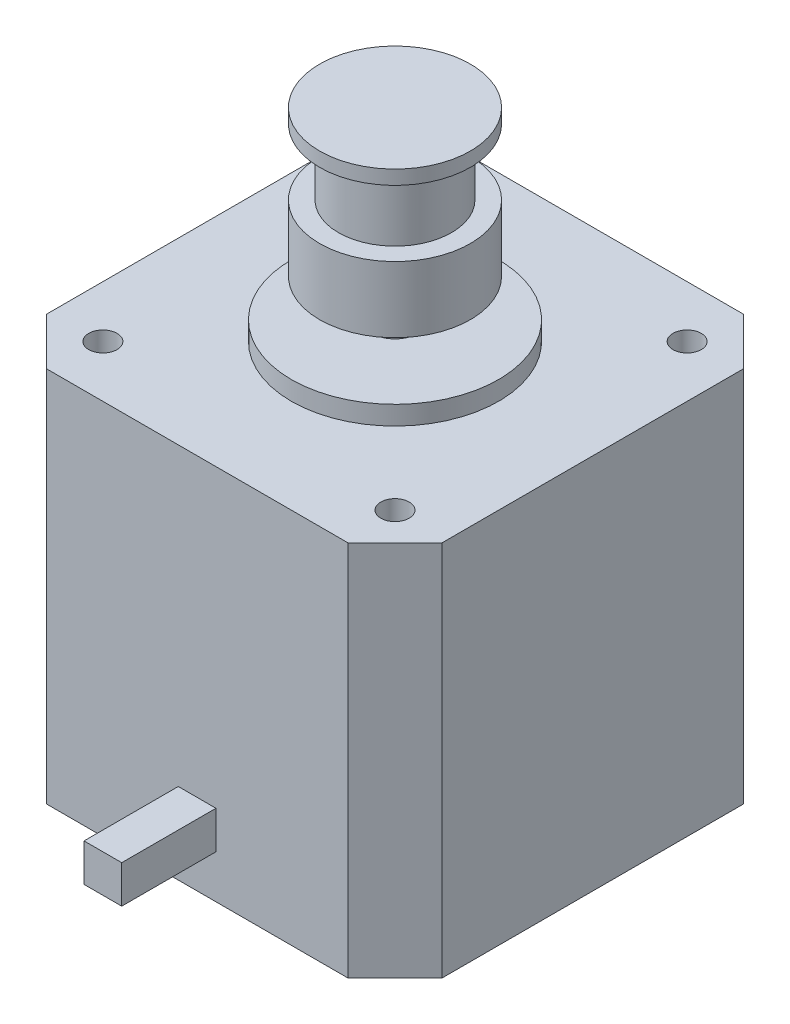
ISO-10303-21;
HEADER;
FILE_DESCRIPTION(('STEP AP214'),'2;1');
FILE_NAME('part.step','',(''),(''),'','','');
FILE_SCHEMA(('AUTOMOTIVE_DESIGN { 1 0 10303 214 1 1 1 1 }'));
ENDSEC;
DATA;
#1=APPLICATION_CONTEXT('core data for automotive mechanical design processes');
#2=APPLICATION_PROTOCOL_DEFINITION('international standard','automotive_design',2000,#1);
#3=PRODUCT_CONTEXT('',#1,'mechanical');
#4=PRODUCT('Part','Part','',(#3));
#5=PRODUCT_RELATED_PRODUCT_CATEGORY('part','',(#4));
#6=PRODUCT_DEFINITION_FORMATION('','',#4);
#7=PRODUCT_DEFINITION_CONTEXT('part definition',#1,'design');
#8=PRODUCT_DEFINITION('design','',#6,#7);
#9=PRODUCT_DEFINITION_SHAPE('','',#8);
#10=(LENGTH_UNIT() NAMED_UNIT(*) SI_UNIT(.MILLI.,.METRE.));
#11=(NAMED_UNIT(*) PLANE_ANGLE_UNIT() SI_UNIT($,.RADIAN.));
#12=(NAMED_UNIT(*) SI_UNIT($,.STERADIAN.) SOLID_ANGLE_UNIT());
#13=UNCERTAINTY_MEASURE_WITH_UNIT(LENGTH_MEASURE(1.E-05),#10,'distance_accuracy_value','');
#14=(GEOMETRIC_REPRESENTATION_CONTEXT(3) GLOBAL_UNCERTAINTY_ASSIGNED_CONTEXT((#13)) GLOBAL_UNIT_ASSIGNED_CONTEXT((#10,
#11,#12)) REPRESENTATION_CONTEXT('',''));
#15=CARTESIAN_POINT('',(0.,0.,0.));
#16=DIRECTION('',(0.,0.,1.));
#17=DIRECTION('',(1.,0.,0.));
#18=AXIS2_PLACEMENT_3D('',#15,#16,#17);
#19=CARTESIAN_POINT('',(-21.,40.,21.));
#20=DIRECTION('',(0.,0.,-1.));
#21=DIRECTION('',(-1.,0.,0.));
#22=AXIS2_PLACEMENT_3D('',#19,#20,#21);
#23=PLANE('',#22);
#24=DIRECTION('',(1.,0.,0.));
#25=VECTOR('',#24,1.);
#26=CARTESIAN_POINT('',(-21.,40.,21.));
#27=LINE('',#26,#25);
#28=CARTESIAN_POINT('',(-16.,40.,21.));
#29=VERTEX_POINT('',#28);
#30=CARTESIAN_POINT('',(16.,40.,21.));
#31=VERTEX_POINT('',#30);
#32=EDGE_CURVE('E245',#29,#31,#27,.T.);
#33=ORIENTED_EDGE('',*,*,#32,.F.);
#34=DIRECTION('',(0.,-1.,0.));
#35=VECTOR('',#34,1.);
#36=CARTESIAN_POINT('',(-16.,40.,21.));
#37=LINE('',#36,#35);
#38=CARTESIAN_POINT('',(-16.,0.,21.));
#39=VERTEX_POINT('',#38);
#40=EDGE_CURVE('E46',#29,#39,#37,.T.);
#41=ORIENTED_EDGE('',*,*,#40,.T.);
#42=DIRECTION('',(1.,0.,0.));
#43=VECTOR('',#42,1.);
#44=CARTESIAN_POINT('',(-21.,0.,21.));
#45=LINE('',#44,#43);
#46=CARTESIAN_POINT('',(16.,0.,21.));
#47=VERTEX_POINT('',#46);
#48=EDGE_CURVE('E237',#39,#47,#45,.T.);
#49=ORIENTED_EDGE('',*,*,#48,.T.);
#50=DIRECTION('',(0.,1.,0.));
#51=VECTOR('',#50,1.);
#52=CARTESIAN_POINT('',(16.,40.,21.));
#53=LINE('',#52,#51);
#54=EDGE_CURVE('E307',#47,#31,#53,.T.);
#55=ORIENTED_EDGE('',*,*,#54,.T.);
#56=EDGE_LOOP('',(#33,#41,#49,#55));
#57=FACE_BOUND('',#56,.T.);
#58=DIRECTION('',(0.,1.,0.));
#59=VECTOR('',#58,1.);
#60=CARTESIAN_POINT('',(2.,4.6,21.));
#61=LINE('',#60,#59);
#62=CARTESIAN_POINT('',(2.,4.6,21.));
#63=VERTEX_POINT('',#62);
#64=CARTESIAN_POINT('',(2.,8.6,21.));
#65=VERTEX_POINT('',#64);
#66=EDGE_CURVE('E156',#63,#65,#61,.T.);
#67=ORIENTED_EDGE('',*,*,#66,.F.);
#68=DIRECTION('',(1.,0.,0.));
#69=VECTOR('',#68,1.);
#70=CARTESIAN_POINT('',(-2.,4.6,21.));
#71=LINE('',#70,#69);
#72=CARTESIAN_POINT('',(-2.,4.6,21.));
#73=VERTEX_POINT('',#72);
#74=EDGE_CURVE('E153',#73,#63,#71,.T.);
#75=ORIENTED_EDGE('',*,*,#74,.F.);
#76=DIRECTION('',(0.,-1.,0.));
#77=VECTOR('',#76,1.);
#78=CARTESIAN_POINT('',(-2.,4.6,21.));
#79=LINE('',#78,#77);
#80=CARTESIAN_POINT('',(-2.,8.6,21.));
#81=VERTEX_POINT('',#80);
#82=EDGE_CURVE('E65',#81,#73,#79,.T.);
#83=ORIENTED_EDGE('',*,*,#82,.F.);
#84=DIRECTION('',(-1.,0.,0.));
#85=VECTOR('',#84,1.);
#86=CARTESIAN_POINT('',(-2.,8.6,21.));
#87=LINE('',#86,#85);
#88=EDGE_CURVE('E60',#65,#81,#87,.T.);
#89=ORIENTED_EDGE('',*,*,#88,.F.);
#90=EDGE_LOOP('',(#67,#75,#83,#89));
#91=FACE_BOUND('',#90,.T.);
#92=ADVANCED_FACE('F41',(#57,#91),#23,.F.);
#93=CARTESIAN_POINT('',(21.,40.,21.));
#94=DIRECTION('',(-1.,0.,0.));
#95=DIRECTION('',(0.,0.,1.));
#96=AXIS2_PLACEMENT_3D('',#93,#94,#95);
#97=PLANE('',#96);
#98=DIRECTION('',(0.,0.,-1.));
#99=VECTOR('',#98,1.);
#100=CARTESIAN_POINT('',(21.,0.,21.));
#101=LINE('',#100,#99);
#102=CARTESIAN_POINT('',(21.,0.,16.));
#103=VERTEX_POINT('',#102);
#104=CARTESIAN_POINT('',(21.,0.,-16.));
#105=VERTEX_POINT('',#104);
#106=EDGE_CURVE('E228',#103,#105,#101,.T.);
#107=ORIENTED_EDGE('',*,*,#106,.T.);
#108=DIRECTION('',(0.,1.,0.));
#109=VECTOR('',#108,1.);
#110=CARTESIAN_POINT('',(21.,40.,-16.));
#111=LINE('',#110,#109);
#112=CARTESIAN_POINT('',(21.,40.,-16.));
#113=VERTEX_POINT('',#112);
#114=EDGE_CURVE('E305',#105,#113,#111,.T.);
#115=ORIENTED_EDGE('',*,*,#114,.T.);
#116=DIRECTION('',(0.,0.,-1.));
#117=VECTOR('',#116,1.);
#118=CARTESIAN_POINT('',(21.,40.,21.));
#119=LINE('',#118,#117);
#120=CARTESIAN_POINT('',(21.,40.,16.));
#121=VERTEX_POINT('',#120);
#122=EDGE_CURVE('E232',#121,#113,#119,.T.);
#123=ORIENTED_EDGE('',*,*,#122,.F.);
#124=DIRECTION('',(0.,-1.,0.));
#125=VECTOR('',#124,1.);
#126=CARTESIAN_POINT('',(21.,40.,16.));
#127=LINE('',#126,#125);
#128=EDGE_CURVE('E301',#121,#103,#127,.T.);
#129=ORIENTED_EDGE('',*,*,#128,.T.);
#130=EDGE_LOOP('',(#107,#115,#123,#129));
#131=FACE_BOUND('',#130,.T.);
#132=ADVANCED_FACE('F327',(#131),#97,.F.);
#133=CARTESIAN_POINT('',(-21.,40.,-21.));
#134=DIRECTION('',(0.,0.,1.));
#135=DIRECTION('',(1.,0.,0.));
#136=AXIS2_PLACEMENT_3D('',#133,#134,#135);
#137=PLANE('',#136);
#138=DIRECTION('',(-1.,0.,0.));
#139=VECTOR('',#138,1.);
#140=CARTESIAN_POINT('',(-21.,0.,-21.));
#141=LINE('',#140,#139);
#142=CARTESIAN_POINT('',(16.,0.,-21.));
#143=VERTEX_POINT('',#142);
#144=CARTESIAN_POINT('',(-16.,0.,-21.));
#145=VERTEX_POINT('',#144);
#146=EDGE_CURVE('E253',#143,#145,#141,.T.);
#147=ORIENTED_EDGE('',*,*,#146,.T.);
#148=DIRECTION('',(0.,1.,0.));
#149=VECTOR('',#148,1.);
#150=CARTESIAN_POINT('',(-16.,40.,-21.));
#151=LINE('',#150,#149);
#152=CARTESIAN_POINT('',(-16.,40.,-21.));
#153=VERTEX_POINT('',#152);
#154=EDGE_CURVE('E286',#145,#153,#151,.T.);
#155=ORIENTED_EDGE('',*,*,#154,.T.);
#156=DIRECTION('',(-1.,0.,0.));
#157=VECTOR('',#156,1.);
#158=CARTESIAN_POINT('',(-21.,40.,-21.));
#159=LINE('',#158,#157);
#160=CARTESIAN_POINT('',(16.,40.,-21.));
#161=VERTEX_POINT('',#160);
#162=EDGE_CURVE('E236',#161,#153,#159,.T.);
#163=ORIENTED_EDGE('',*,*,#162,.F.);
#164=DIRECTION('',(0.,-1.,0.));
#165=VECTOR('',#164,1.);
#166=CARTESIAN_POINT('',(16.,40.,-21.));
#167=LINE('',#166,#165);
#168=EDGE_CURVE('E282',#161,#143,#167,.T.);
#169=ORIENTED_EDGE('',*,*,#168,.T.);
#170=EDGE_LOOP('',(#147,#155,#163,#169));
#171=FACE_BOUND('',#170,.T.);
#172=ADVANCED_FACE('F338',(#171),#137,.F.);
#173=CARTESIAN_POINT('',(-21.,40.,21.));
#174=DIRECTION('',(1.,0.,0.));
#175=DIRECTION('',(0.,0.,-1.));
#176=AXIS2_PLACEMENT_3D('',#173,#174,#175);
#177=PLANE('',#176);
#178=DIRECTION('',(0.,0.,1.));
#179=VECTOR('',#178,1.);
#180=CARTESIAN_POINT('',(-21.,40.,21.));
#181=LINE('',#180,#179);
#182=CARTESIAN_POINT('',(-21.,40.,-16.));
#183=VERTEX_POINT('',#182);
#184=CARTESIAN_POINT('',(-21.,40.,16.));
#185=VERTEX_POINT('',#184);
#186=EDGE_CURVE('E241',#183,#185,#181,.T.);
#187=ORIENTED_EDGE('',*,*,#186,.F.);
#188=DIRECTION('',(0.,-1.,0.));
#189=VECTOR('',#188,1.);
#190=CARTESIAN_POINT('',(-21.,40.,-16.));
#191=LINE('',#190,#189);
#192=CARTESIAN_POINT('',(-21.,0.,-16.));
#193=VERTEX_POINT('',#192);
#194=EDGE_CURVE('E266',#183,#193,#191,.T.);
#195=ORIENTED_EDGE('',*,*,#194,.T.);
#196=DIRECTION('',(0.,0.,1.));
#197=VECTOR('',#196,1.);
#198=CARTESIAN_POINT('',(-21.,0.,21.));
#199=LINE('',#198,#197);
#200=CARTESIAN_POINT('',(-21.,0.,16.));
#201=VERTEX_POINT('',#200);
#202=EDGE_CURVE('E257',#193,#201,#199,.T.);
#203=ORIENTED_EDGE('',*,*,#202,.T.);
#204=DIRECTION('',(0.,1.,0.));
#205=VECTOR('',#204,1.);
#206=CARTESIAN_POINT('',(-21.,40.,16.));
#207=LINE('',#206,#205);
#208=EDGE_CURVE('E249',#201,#185,#207,.T.);
#209=ORIENTED_EDGE('',*,*,#208,.T.);
#210=EDGE_LOOP('',(#187,#195,#203,#209));
#211=FACE_BOUND('',#210,.T.);
#212=ADVANCED_FACE('F346',(#211),#177,.F.);
#213=CARTESIAN_POINT('',(0.,40.,0.));
#214=DIRECTION('',(0.,-1.,0.));
#215=DIRECTION('',(0.,0.,-1.));
#216=AXIS2_PLACEMENT_3D('',#213,#214,#215);
#217=PLANE('',#216);
#218=CARTESIAN_POINT('',(-15.5,40.,15.5));
#219=DIRECTION('',(0.,1.,0.));
#220=DIRECTION('',(0.,0.,1.));
#221=AXIS2_PLACEMENT_3D('',#218,#219,#220);
#222=CIRCLE('',#221,1.5);
#223=CARTESIAN_POINT('',(-15.5,40.,17.));
#224=VERTEX_POINT('',#223);
#225=EDGE_CURVE('E158',#224,#224,#222,.T.);
#226=ORIENTED_EDGE('',*,*,#225,.F.);
#227=EDGE_LOOP('',(#226));
#228=FACE_BOUND('',#227,.T.);
#229=CARTESIAN_POINT('',(15.5,40.,15.5));
#230=DIRECTION('',(0.,1.,0.));
#231=DIRECTION('',(0.,0.,1.));
#232=AXIS2_PLACEMENT_3D('',#229,#230,#231);
#233=CIRCLE('',#232,1.5);
#234=CARTESIAN_POINT('',(15.5,40.,17.));
#235=VERTEX_POINT('',#234);
#236=EDGE_CURVE('E182',#235,#235,#233,.T.);
#237=ORIENTED_EDGE('',*,*,#236,.F.);
#238=EDGE_LOOP('',(#237));
#239=FACE_BOUND('',#238,.T.);
#240=CARTESIAN_POINT('',(15.5,40.,-15.5));
#241=DIRECTION('',(0.,1.,0.));
#242=DIRECTION('',(0.,0.,1.));
#243=AXIS2_PLACEMENT_3D('',#240,#241,#242);
#244=CIRCLE('',#243,1.5);
#245=CARTESIAN_POINT('',(15.5,40.,-14.));
#246=VERTEX_POINT('',#245);
#247=EDGE_CURVE('E174',#246,#246,#244,.T.);
#248=ORIENTED_EDGE('',*,*,#247,.F.);
#249=EDGE_LOOP('',(#248));
#250=FACE_BOUND('',#249,.T.);
#251=CARTESIAN_POINT('',(-15.5,40.,-15.5));
#252=DIRECTION('',(0.,1.,0.));
#253=DIRECTION('',(0.,0.,1.));
#254=AXIS2_PLACEMENT_3D('',#251,#252,#253);
#255=CIRCLE('',#254,1.5);
#256=CARTESIAN_POINT('',(-15.5,40.,-14.));
#257=VERTEX_POINT('',#256);
#258=EDGE_CURVE('E173',#257,#257,#255,.T.);
#259=ORIENTED_EDGE('',*,*,#258,.F.);
#260=EDGE_LOOP('',(#259));
#261=FACE_BOUND('',#260,.T.);
#262=CARTESIAN_POINT('',(0.,40.,0.));
#263=DIRECTION('',(0.,1.,0.));
#264=DIRECTION('',(0.,0.,1.));
#265=AXIS2_PLACEMENT_3D('',#262,#263,#264);
#266=CIRCLE('',#265,11.);
#267=CARTESIAN_POINT('',(0.,40.,11.));
#268=VERTEX_POINT('',#267);
#269=EDGE_CURVE('E224',#268,#268,#266,.T.);
#270=ORIENTED_EDGE('',*,*,#269,.F.);
#271=EDGE_LOOP('',(#270));
#272=FACE_BOUND('',#271,.T.);
#273=ORIENTED_EDGE('',*,*,#162,.T.);
#274=DIRECTION('',(0.707106781186549,0.,-0.707106781186546));
#275=VECTOR('',#274,1.);
#276=CARTESIAN_POINT('',(-21.,40.,-16.));
#277=LINE('',#276,#275);
#278=EDGE_CURVE('E298',#153,#183,#277,.F.);
#279=ORIENTED_EDGE('',*,*,#278,.T.);
#280=ORIENTED_EDGE('',*,*,#186,.T.);
#281=DIRECTION('',(-0.707106781186547,0.,-0.707106781186549));
#282=VECTOR('',#281,1.);
#283=CARTESIAN_POINT('',(-16.,40.,21.));
#284=LINE('',#283,#282);
#285=EDGE_CURVE('E292',#185,#29,#284,.F.);
#286=ORIENTED_EDGE('',*,*,#285,.T.);
#287=ORIENTED_EDGE('',*,*,#32,.T.);
#288=DIRECTION('',(-0.707106781186549,0.,0.707106781186547));
#289=VECTOR('',#288,1.);
#290=CARTESIAN_POINT('',(21.,40.,16.));
#291=LINE('',#290,#289);
#292=EDGE_CURVE('E289',#31,#121,#291,.F.);
#293=ORIENTED_EDGE('',*,*,#292,.T.);
#294=ORIENTED_EDGE('',*,*,#122,.T.);
#295=DIRECTION('',(0.707106781186547,0.,0.707106781186549));
#296=VECTOR('',#295,1.);
#297=CARTESIAN_POINT('',(16.,40.,-21.));
#298=LINE('',#297,#296);
#299=EDGE_CURVE('E295',#113,#161,#298,.F.);
#300=ORIENTED_EDGE('',*,*,#299,.T.);
#301=EDGE_LOOP('',(#273,#279,#280,#286,#287,#293,#294,#300));
#302=FACE_BOUND('',#301,.T.);
#303=ADVANCED_FACE('F331',(#228,#239,#250,#261,#272,#302),#217,.F.);
#304=CARTESIAN_POINT('',(0.,0.,0.));
#305=DIRECTION('',(0.,-1.,0.));
#306=DIRECTION('',(0.,0.,-1.));
#307=AXIS2_PLACEMENT_3D('',#304,#305,#306);
#308=PLANE('',#307);
#309=ORIENTED_EDGE('',*,*,#202,.F.);
#310=DIRECTION('',(-0.707106781186549,0.,0.707106781186546));
#311=VECTOR('',#310,1.);
#312=CARTESIAN_POINT('',(-18.5,0.,-18.5));
#313=LINE('',#312,#311);
#314=EDGE_CURVE('E279',#193,#145,#313,.F.);
#315=ORIENTED_EDGE('',*,*,#314,.T.);
#316=ORIENTED_EDGE('',*,*,#146,.F.);
#317=DIRECTION('',(-0.707106781186547,0.,-0.707106781186549));
#318=VECTOR('',#317,1.);
#319=CARTESIAN_POINT('',(18.5,0.,-18.5));
#320=LINE('',#319,#318);
#321=EDGE_CURVE('E276',#143,#105,#320,.F.);
#322=ORIENTED_EDGE('',*,*,#321,.T.);
#323=ORIENTED_EDGE('',*,*,#106,.F.);
#324=DIRECTION('',(0.707106781186549,0.,-0.707106781186547));
#325=VECTOR('',#324,1.);
#326=CARTESIAN_POINT('',(18.5,0.,18.5));
#327=LINE('',#326,#325);
#328=EDGE_CURVE('E270',#103,#47,#327,.F.);
#329=ORIENTED_EDGE('',*,*,#328,.T.);
#330=ORIENTED_EDGE('',*,*,#48,.F.);
#331=DIRECTION('',(0.707106781186547,0.,0.707106781186549));
#332=VECTOR('',#331,1.);
#333=CARTESIAN_POINT('',(-18.5,0.,18.5));
#334=LINE('',#333,#332);
#335=EDGE_CURVE('E273',#39,#201,#334,.F.);
#336=ORIENTED_EDGE('',*,*,#335,.T.);
#337=EDGE_LOOP('',(#309,#315,#316,#322,#323,#329,#330,#336));
#338=FACE_BOUND('',#337,.T.);
#339=ADVANCED_FACE('F320',(#338),#308,.T.);
#340=CARTESIAN_POINT('',(-21.,40.,-16.));
#341=DIRECTION('',(0.707106781186546,0.,0.707106781186549));
#342=DIRECTION('',(0.,-1.,0.));
#343=AXIS2_PLACEMENT_3D('',#340,#341,#342);
#344=PLANE('',#343);
#345=ORIENTED_EDGE('',*,*,#278,.F.);
#346=ORIENTED_EDGE('',*,*,#154,.F.);
#347=ORIENTED_EDGE('',*,*,#314,.F.);
#348=ORIENTED_EDGE('',*,*,#194,.F.);
#349=EDGE_LOOP('',(#345,#346,#347,#348));
#350=FACE_BOUND('',#349,.T.);
#351=ADVANCED_FACE('F343',(#350),#344,.F.);
#352=CARTESIAN_POINT('',(16.,40.,-21.));
#353=DIRECTION('',(-0.707106781186549,0.,0.707106781186547));
#354=DIRECTION('',(0.,-1.,0.));
#355=AXIS2_PLACEMENT_3D('',#352,#353,#354);
#356=PLANE('',#355);
#357=ORIENTED_EDGE('',*,*,#299,.F.);
#358=ORIENTED_EDGE('',*,*,#114,.F.);
#359=ORIENTED_EDGE('',*,*,#321,.F.);
#360=ORIENTED_EDGE('',*,*,#168,.F.);
#361=EDGE_LOOP('',(#357,#358,#359,#360));
#362=FACE_BOUND('',#361,.T.);
#363=ADVANCED_FACE('F335',(#362),#356,.F.);
#364=CARTESIAN_POINT('',(-16.,40.,21.));
#365=DIRECTION('',(0.707106781186548,0.,-0.707106781186546));
#366=DIRECTION('',(0.,-1.,0.));
#367=AXIS2_PLACEMENT_3D('',#364,#365,#366);
#368=PLANE('',#367);
#369=ORIENTED_EDGE('',*,*,#285,.F.);
#370=ORIENTED_EDGE('',*,*,#208,.F.);
#371=ORIENTED_EDGE('',*,*,#335,.F.);
#372=ORIENTED_EDGE('',*,*,#40,.F.);
#373=EDGE_LOOP('',(#369,#370,#371,#372));
#374=FACE_BOUND('',#373,.T.);
#375=ADVANCED_FACE('F348',(#374),#368,.F.);
#376=CARTESIAN_POINT('',(21.,40.,16.));
#377=DIRECTION('',(-0.707106781186547,0.,-0.707106781186549));
#378=DIRECTION('',(0.,-1.,0.));
#379=AXIS2_PLACEMENT_3D('',#376,#377,#378);
#380=PLANE('',#379);
#381=ORIENTED_EDGE('',*,*,#292,.F.);
#382=ORIENTED_EDGE('',*,*,#54,.F.);
#383=ORIENTED_EDGE('',*,*,#328,.F.);
#384=ORIENTED_EDGE('',*,*,#128,.F.);
#385=EDGE_LOOP('',(#381,#382,#383,#384));
#386=FACE_BOUND('',#385,.T.);
#387=ADVANCED_FACE('F44',(#386),#380,.F.);
#388=CARTESIAN_POINT('',(0.,42.,0.));
#389=DIRECTION('',(0.,-1.,0.));
#390=DIRECTION('',(0.,0.,-1.));
#391=AXIS2_PLACEMENT_3D('',#388,#389,#390);
#392=CYLINDRICAL_SURFACE('',#391,11.);
#393=CARTESIAN_POINT('',(0.,42.,0.));
#394=DIRECTION('',(0.,1.,0.));
#395=DIRECTION('',(0.,0.,1.));
#396=AXIS2_PLACEMENT_3D('',#393,#394,#395);
#397=CIRCLE('',#396,11.);
#398=CARTESIAN_POINT('',(0.,42.,11.));
#399=VERTEX_POINT('',#398);
#400=EDGE_CURVE('E220',#399,#399,#397,.T.);
#401=ORIENTED_EDGE('',*,*,#400,.F.);
#402=EDGE_LOOP('',(#401));
#403=FACE_BOUND('',#402,.T.);
#404=ORIENTED_EDGE('',*,*,#269,.T.);
#405=EDGE_LOOP('',(#404));
#406=FACE_BOUND('',#405,.T.);
#407=ADVANCED_FACE('F354',(#403,#406),#392,.T.);
#408=CARTESIAN_POINT('',(0.,42.,0.));
#409=DIRECTION('',(0.,1.,0.));
#410=DIRECTION('',(0.,0.,1.));
#411=AXIS2_PLACEMENT_3D('',#408,#409,#410);
#412=PLANE('',#411);
#413=CARTESIAN_POINT('',(0.,42.,0.));
#414=DIRECTION('',(0.,1.,0.));
#415=DIRECTION('',(0.,0.,1.));
#416=AXIS2_PLACEMENT_3D('',#413,#414,#415);
#417=CIRCLE('',#416,2.5);
#418=CARTESIAN_POINT('',(0.,42.,2.5));
#419=VERTEX_POINT('',#418);
#420=EDGE_CURVE('E52',#419,#419,#417,.T.);
#421=ORIENTED_EDGE('',*,*,#420,.F.);
#422=EDGE_LOOP('',(#421));
#423=FACE_BOUND('',#422,.T.);
#424=ORIENTED_EDGE('',*,*,#400,.T.);
#425=EDGE_LOOP('',(#424));
#426=FACE_BOUND('',#425,.T.);
#427=ADVANCED_FACE('F395',(#423,#426),#412,.T.);
#428=CARTESIAN_POINT('',(0.,46.,0.));
#429=DIRECTION('',(0.,-1.,0.));
#430=DIRECTION('',(0.,0.,-1.));
#431=AXIS2_PLACEMENT_3D('',#428,#429,#430);
#432=CYLINDRICAL_SURFACE('',#431,2.5);
#433=CARTESIAN_POINT('',(0.,46.,0.));
#434=DIRECTION('',(0.,1.,0.));
#435=DIRECTION('',(0.,0.,1.));
#436=AXIS2_PLACEMENT_3D('',#433,#434,#435);
#437=CIRCLE('',#436,2.5);
#438=CARTESIAN_POINT('',(0.,46.,2.5));
#439=VERTEX_POINT('',#438);
#440=EDGE_CURVE('E213',#439,#439,#437,.T.);
#441=ORIENTED_EDGE('',*,*,#440,.F.);
#442=EDGE_LOOP('',(#441));
#443=FACE_BOUND('',#442,.T.);
#444=ORIENTED_EDGE('',*,*,#420,.T.);
#445=EDGE_LOOP('',(#444));
#446=FACE_BOUND('',#445,.T.);
#447=ADVANCED_FACE('F399',(#443,#446),#432,.T.);
#448=CARTESIAN_POINT('',(0.,53.,0.));
#449=DIRECTION('',(0.,-1.,0.));
#450=DIRECTION('',(0.,0.,-1.));
#451=AXIS2_PLACEMENT_3D('',#448,#449,#450);
#452=CYLINDRICAL_SURFACE('',#451,8.);
#453=CARTESIAN_POINT('',(0.,53.,0.));
#454=DIRECTION('',(0.,1.,0.));
#455=DIRECTION('',(0.,0.,1.));
#456=AXIS2_PLACEMENT_3D('',#453,#454,#455);
#457=CIRCLE('',#456,8.);
#458=CARTESIAN_POINT('',(0.,53.,8.));
#459=VERTEX_POINT('',#458);
#460=EDGE_CURVE('E209',#459,#459,#457,.T.);
#461=ORIENTED_EDGE('',*,*,#460,.F.);
#462=EDGE_LOOP('',(#461));
#463=FACE_BOUND('',#462,.T.);
#464=CARTESIAN_POINT('',(0.,46.,0.));
#465=DIRECTION('',(0.,1.,0.));
#466=DIRECTION('',(0.,0.,1.));
#467=AXIS2_PLACEMENT_3D('',#464,#465,#466);
#468=CIRCLE('',#467,8.);
#469=CARTESIAN_POINT('',(0.,46.,8.));
#470=VERTEX_POINT('',#469);
#471=EDGE_CURVE('E207',#470,#470,#468,.T.);
#472=ORIENTED_EDGE('',*,*,#471,.T.);
#473=EDGE_LOOP('',(#472));
#474=FACE_BOUND('',#473,.T.);
#475=ADVANCED_FACE('F403',(#463,#474),#452,.T.);
#476=CARTESIAN_POINT('',(0.,53.,0.));
#477=DIRECTION('',(0.,1.,0.));
#478=DIRECTION('',(0.,0.,1.));
#479=AXIS2_PLACEMENT_3D('',#476,#477,#478);
#480=PLANE('',#479);
#481=CARTESIAN_POINT('',(0.,53.,0.));
#482=DIRECTION('',(0.,1.,0.));
#483=DIRECTION('',(0.,0.,1.));
#484=AXIS2_PLACEMENT_3D('',#481,#482,#483);
#485=CIRCLE('',#484,6.);
#486=CARTESIAN_POINT('',(0.,53.,6.));
#487=VERTEX_POINT('',#486);
#488=EDGE_CURVE('E11',#487,#487,#485,.T.);
#489=ORIENTED_EDGE('',*,*,#488,.F.);
#490=EDGE_LOOP('',(#489));
#491=FACE_BOUND('',#490,.T.);
#492=ORIENTED_EDGE('',*,*,#460,.T.);
#493=EDGE_LOOP('',(#492));
#494=FACE_BOUND('',#493,.T.);
#495=ADVANCED_FACE('F407',(#491,#494),#480,.T.);
#496=CARTESIAN_POINT('',(0.,46.,0.));
#497=DIRECTION('',(0.,1.,0.));
#498=DIRECTION('',(0.,0.,1.));
#499=AXIS2_PLACEMENT_3D('',#496,#497,#498);
#500=PLANE('',#499);
#501=ORIENTED_EDGE('',*,*,#440,.T.);
#502=EDGE_LOOP('',(#501));
#503=FACE_BOUND('',#502,.T.);
#504=ORIENTED_EDGE('',*,*,#471,.F.);
#505=EDGE_LOOP('',(#504));
#506=FACE_BOUND('',#505,.T.);
#507=ADVANCED_FACE('F409',(#503,#506),#500,.F.);
#508=CARTESIAN_POINT('',(0.,60.,0.));
#509=DIRECTION('',(0.,-1.,0.));
#510=DIRECTION('',(0.,0.,-1.));
#511=AXIS2_PLACEMENT_3D('',#508,#509,#510);
#512=CYLINDRICAL_SURFACE('',#511,6.);
#513=CARTESIAN_POINT('',(0.,60.,0.));
#514=DIRECTION('',(0.,1.,0.));
#515=DIRECTION('',(0.,0.,1.));
#516=AXIS2_PLACEMENT_3D('',#513,#514,#515);
#517=CIRCLE('',#516,6.);
#518=CARTESIAN_POINT('',(0.,60.,6.));
#519=VERTEX_POINT('',#518);
#520=EDGE_CURVE('E201',#519,#519,#517,.T.);
#521=ORIENTED_EDGE('',*,*,#520,.F.);
#522=EDGE_LOOP('',(#521));
#523=FACE_BOUND('',#522,.T.);
#524=ORIENTED_EDGE('',*,*,#488,.T.);
#525=EDGE_LOOP('',(#524));
#526=FACE_BOUND('',#525,.T.);
#527=ADVANCED_FACE('F412',(#523,#526),#512,.T.);
#528=CARTESIAN_POINT('',(0.,61.5,0.));
#529=DIRECTION('',(0.,-1.,0.));
#530=DIRECTION('',(0.,0.,-1.));
#531=AXIS2_PLACEMENT_3D('',#528,#529,#530);
#532=CYLINDRICAL_SURFACE('',#531,8.);
#533=CARTESIAN_POINT('',(0.,61.5,0.));
#534=DIRECTION('',(0.,1.,0.));
#535=DIRECTION('',(0.,0.,1.));
#536=AXIS2_PLACEMENT_3D('',#533,#534,#535);
#537=CIRCLE('',#536,8.);
#538=CARTESIAN_POINT('',(0.,61.5,8.));
#539=VERTEX_POINT('',#538);
#540=EDGE_CURVE('E197',#539,#539,#537,.T.);
#541=ORIENTED_EDGE('',*,*,#540,.F.);
#542=EDGE_LOOP('',(#541));
#543=FACE_BOUND('',#542,.T.);
#544=CARTESIAN_POINT('',(0.,60.,0.));
#545=DIRECTION('',(0.,1.,0.));
#546=DIRECTION('',(0.,0.,1.));
#547=AXIS2_PLACEMENT_3D('',#544,#545,#546);
#548=CIRCLE('',#547,8.);
#549=CARTESIAN_POINT('',(0.,60.,8.));
#550=VERTEX_POINT('',#549);
#551=EDGE_CURVE('E193',#550,#550,#548,.T.);
#552=ORIENTED_EDGE('',*,*,#551,.T.);
#553=EDGE_LOOP('',(#552));
#554=FACE_BOUND('',#553,.T.);
#555=ADVANCED_FACE('F419',(#543,#554),#532,.T.);
#556=CARTESIAN_POINT('',(0.,61.5,0.));
#557=DIRECTION('',(0.,1.,0.));
#558=DIRECTION('',(0.,0.,1.));
#559=AXIS2_PLACEMENT_3D('',#556,#557,#558);
#560=PLANE('',#559);
#561=ORIENTED_EDGE('',*,*,#540,.T.);
#562=EDGE_LOOP('',(#561));
#563=FACE_BOUND('',#562,.T.);
#564=ADVANCED_FACE('F423',(#563),#560,.T.);
#565=CARTESIAN_POINT('',(0.,60.,0.));
#566=DIRECTION('',(0.,1.,0.));
#567=DIRECTION('',(0.,0.,1.));
#568=AXIS2_PLACEMENT_3D('',#565,#566,#567);
#569=PLANE('',#568);
#570=ORIENTED_EDGE('',*,*,#520,.T.);
#571=EDGE_LOOP('',(#570));
#572=FACE_BOUND('',#571,.T.);
#573=ORIENTED_EDGE('',*,*,#551,.F.);
#574=EDGE_LOOP('',(#573));
#575=FACE_BOUND('',#574,.T.);
#576=ADVANCED_FACE('F425',(#572,#575),#569,.F.);
#577=CARTESIAN_POINT('',(-15.5,35.5,-15.5));
#578=DIRECTION('',(0.,1.,0.));
#579=DIRECTION('',(0.,0.,1.));
#580=AXIS2_PLACEMENT_3D('',#577,#578,#579);
#581=CYLINDRICAL_SURFACE('',#580,1.5);
#582=CARTESIAN_POINT('',(-15.5,35.5,-15.5));
#583=DIRECTION('',(0.,1.,0.));
#584=DIRECTION('',(0.,0.,1.));
#585=AXIS2_PLACEMENT_3D('',#582,#583,#584);
#586=CIRCLE('',#585,1.5);
#587=CARTESIAN_POINT('',(-15.5,35.5,-14.));
#588=VERTEX_POINT('',#587);
#589=EDGE_CURVE('E189',#588,#588,#586,.T.);
#590=ORIENTED_EDGE('',*,*,#589,.F.);
#591=EDGE_LOOP('',(#590));
#592=FACE_BOUND('',#591,.T.);
#593=ORIENTED_EDGE('',*,*,#258,.T.);
#594=EDGE_LOOP('',(#593));
#595=FACE_BOUND('',#594,.T.);
#596=ADVANCED_FACE('F428',(#592,#595),#581,.F.);
#597=CARTESIAN_POINT('',(-15.5,35.5,-15.5));
#598=DIRECTION('',(0.,1.,0.));
#599=DIRECTION('',(0.,0.,1.));
#600=AXIS2_PLACEMENT_3D('',#597,#598,#599);
#601=PLANE('',#600);
#602=ORIENTED_EDGE('',*,*,#589,.T.);
#603=EDGE_LOOP('',(#602));
#604=FACE_BOUND('',#603,.T.);
#605=ADVANCED_FACE('F435',(#604),#601,.T.);
#606=CARTESIAN_POINT('',(15.5,35.5,-15.5));
#607=DIRECTION('',(0.,1.,0.));
#608=DIRECTION('',(0.,0.,1.));
#609=AXIS2_PLACEMENT_3D('',#606,#607,#608);
#610=CYLINDRICAL_SURFACE('',#609,1.5);
#611=CARTESIAN_POINT('',(15.5,35.5,-15.5));
#612=DIRECTION('',(0.,1.,0.));
#613=DIRECTION('',(0.,0.,1.));
#614=AXIS2_PLACEMENT_3D('',#611,#612,#613);
#615=CIRCLE('',#614,1.5);
#616=CARTESIAN_POINT('',(15.5,35.5,-14.));
#617=VERTEX_POINT('',#616);
#618=EDGE_CURVE('E169',#617,#617,#615,.T.);
#619=ORIENTED_EDGE('',*,*,#618,.F.);
#620=EDGE_LOOP('',(#619));
#621=FACE_BOUND('',#620,.T.);
#622=ORIENTED_EDGE('',*,*,#247,.T.);
#623=EDGE_LOOP('',(#622));
#624=FACE_BOUND('',#623,.T.);
#625=ADVANCED_FACE('F439',(#621,#624),#610,.F.);
#626=CARTESIAN_POINT('',(15.5,35.5,-15.5));
#627=DIRECTION('',(0.,1.,0.));
#628=DIRECTION('',(0.,0.,1.));
#629=AXIS2_PLACEMENT_3D('',#626,#627,#628);
#630=PLANE('',#629);
#631=ORIENTED_EDGE('',*,*,#618,.T.);
#632=EDGE_LOOP('',(#631));
#633=FACE_BOUND('',#632,.T.);
#634=ADVANCED_FACE('F453',(#633),#630,.T.);
#635=CARTESIAN_POINT('',(15.5,35.5,15.5));
#636=DIRECTION('',(0.,1.,0.));
#637=DIRECTION('',(0.,0.,1.));
#638=AXIS2_PLACEMENT_3D('',#635,#636,#637);
#639=CYLINDRICAL_SURFACE('',#638,1.5);
#640=CARTESIAN_POINT('',(15.5,35.5,15.5));
#641=DIRECTION('',(0.,1.,0.));
#642=DIRECTION('',(0.,0.,1.));
#643=AXIS2_PLACEMENT_3D('',#640,#641,#642);
#644=CIRCLE('',#643,1.5);
#645=CARTESIAN_POINT('',(15.5,35.5,17.));
#646=VERTEX_POINT('',#645);
#647=EDGE_CURVE('E178',#646,#646,#644,.T.);
#648=ORIENTED_EDGE('',*,*,#647,.F.);
#649=EDGE_LOOP('',(#648));
#650=FACE_BOUND('',#649,.T.);
#651=ORIENTED_EDGE('',*,*,#236,.T.);
#652=EDGE_LOOP('',(#651));
#653=FACE_BOUND('',#652,.T.);
#654=ADVANCED_FACE('F450',(#650,#653),#639,.F.);
#655=CARTESIAN_POINT('',(15.5,35.5,15.5));
#656=DIRECTION('',(0.,1.,0.));
#657=DIRECTION('',(0.,0.,1.));
#658=AXIS2_PLACEMENT_3D('',#655,#656,#657);
#659=PLANE('',#658);
#660=ORIENTED_EDGE('',*,*,#647,.T.);
#661=EDGE_LOOP('',(#660));
#662=FACE_BOUND('',#661,.T.);
#663=ADVANCED_FACE('F445',(#662),#659,.T.);
#664=CARTESIAN_POINT('',(-15.5,35.5,15.5));
#665=DIRECTION('',(0.,1.,0.));
#666=DIRECTION('',(0.,0.,1.));
#667=AXIS2_PLACEMENT_3D('',#664,#665,#666);
#668=CYLINDRICAL_SURFACE('',#667,1.5);
#669=CARTESIAN_POINT('',(-15.5,35.5,15.5));
#670=DIRECTION('',(0.,1.,0.));
#671=DIRECTION('',(0.,0.,1.));
#672=AXIS2_PLACEMENT_3D('',#669,#670,#671);
#673=CIRCLE('',#672,1.5);
#674=CARTESIAN_POINT('',(-15.5,35.5,17.));
#675=VERTEX_POINT('',#674);
#676=EDGE_CURVE('E163',#675,#675,#673,.T.);
#677=ORIENTED_EDGE('',*,*,#676,.F.);
#678=EDGE_LOOP('',(#677));
#679=FACE_BOUND('',#678,.T.);
#680=ORIENTED_EDGE('',*,*,#225,.T.);
#681=EDGE_LOOP('',(#680));
#682=FACE_BOUND('',#681,.T.);
#683=ADVANCED_FACE('F441',(#679,#682),#668,.F.);
#684=CARTESIAN_POINT('',(-15.5,35.5,15.5));
#685=DIRECTION('',(0.,1.,0.));
#686=DIRECTION('',(0.,0.,1.));
#687=AXIS2_PLACEMENT_3D('',#684,#685,#686);
#688=PLANE('',#687);
#689=ORIENTED_EDGE('',*,*,#676,.T.);
#690=EDGE_LOOP('',(#689));
#691=FACE_BOUND('',#690,.T.);
#692=ADVANCED_FACE('F444',(#691),#688,.T.);
#693=CARTESIAN_POINT('',(2.,4.6,31.));
#694=DIRECTION('',(-1.,0.,0.));
#695=DIRECTION('',(0.,0.,1.));
#696=AXIS2_PLACEMENT_3D('',#693,#694,#695);
#697=PLANE('',#696);
#698=ORIENTED_EDGE('',*,*,#66,.T.);
#699=DIRECTION('',(0.,0.,-1.));
#700=VECTOR('',#699,1.);
#701=CARTESIAN_POINT('',(2.,8.6,31.));
#702=LINE('',#701,#700);
#703=CARTESIAN_POINT('',(2.,8.6,31.));
#704=VERTEX_POINT('',#703);
#705=EDGE_CURVE('E135',#704,#65,#702,.T.);
#706=ORIENTED_EDGE('',*,*,#705,.F.);
#707=DIRECTION('',(0.,1.,0.));
#708=VECTOR('',#707,1.);
#709=CARTESIAN_POINT('',(2.,4.6,31.));
#710=LINE('',#709,#708);
#711=CARTESIAN_POINT('',(2.,4.6,31.));
#712=VERTEX_POINT('',#711);
#713=EDGE_CURVE('E143',#712,#704,#710,.T.);
#714=ORIENTED_EDGE('',*,*,#713,.F.);
#715=DIRECTION('',(0.,0.,-1.));
#716=VECTOR('',#715,1.);
#717=CARTESIAN_POINT('',(2.,4.6,31.));
#718=LINE('',#717,#716);
#719=EDGE_CURVE('E667',#712,#63,#718,.T.);
#720=ORIENTED_EDGE('',*,*,#719,.T.);
#721=EDGE_LOOP('',(#698,#706,#714,#720));
#722=FACE_BOUND('',#721,.T.);
#723=ADVANCED_FACE('F155',(#722),#697,.F.);
#724=CARTESIAN_POINT('',(-2.,8.6,31.));
#725=DIRECTION('',(0.,-1.,0.));
#726=DIRECTION('',(0.,0.,-1.));
#727=AXIS2_PLACEMENT_3D('',#724,#725,#726);
#728=PLANE('',#727);
#729=ORIENTED_EDGE('',*,*,#88,.T.);
#730=DIRECTION('',(0.,0.,-1.));
#731=VECTOR('',#730,1.);
#732=CARTESIAN_POINT('',(-2.,8.6,31.));
#733=LINE('',#732,#731);
#734=CARTESIAN_POINT('',(-2.,8.6,31.));
#735=VERTEX_POINT('',#734);
#736=EDGE_CURVE('E138',#735,#81,#733,.T.);
#737=ORIENTED_EDGE('',*,*,#736,.F.);
#738=DIRECTION('',(-1.,0.,0.));
#739=VECTOR('',#738,1.);
#740=CARTESIAN_POINT('',(-2.,8.6,31.));
#741=LINE('',#740,#739);
#742=EDGE_CURVE('E131',#704,#735,#741,.T.);
#743=ORIENTED_EDGE('',*,*,#742,.F.);
#744=ORIENTED_EDGE('',*,*,#705,.T.);
#745=EDGE_LOOP('',(#729,#737,#743,#744));
#746=FACE_BOUND('',#745,.T.);
#747=ADVANCED_FACE('F133',(#746),#728,.F.);
#748=CARTESIAN_POINT('',(-2.,4.6,31.));
#749=DIRECTION('',(1.,0.,0.));
#750=DIRECTION('',(0.,0.,-1.));
#751=AXIS2_PLACEMENT_3D('',#748,#749,#750);
#752=PLANE('',#751);
#753=ORIENTED_EDGE('',*,*,#82,.T.);
#754=DIRECTION('',(0.,0.,-1.));
#755=VECTOR('',#754,1.);
#756=CARTESIAN_POINT('',(-2.,4.6,31.));
#757=LINE('',#756,#755);
#758=CARTESIAN_POINT('',(-2.,4.6,31.));
#759=VERTEX_POINT('',#758);
#760=EDGE_CURVE('E165',#759,#73,#757,.T.);
#761=ORIENTED_EDGE('',*,*,#760,.F.);
#762=DIRECTION('',(0.,-1.,0.));
#763=VECTOR('',#762,1.);
#764=CARTESIAN_POINT('',(-2.,4.6,31.));
#765=LINE('',#764,#763);
#766=EDGE_CURVE('E142',#735,#759,#765,.T.);
#767=ORIENTED_EDGE('',*,*,#766,.F.);
#768=ORIENTED_EDGE('',*,*,#736,.T.);
#769=EDGE_LOOP('',(#753,#761,#767,#768));
#770=FACE_BOUND('',#769,.T.);
#771=ADVANCED_FACE('F468',(#770),#752,.F.);
#772=CARTESIAN_POINT('',(-2.,4.6,31.));
#773=DIRECTION('',(0.,1.,0.));
#774=DIRECTION('',(0.,0.,1.));
#775=AXIS2_PLACEMENT_3D('',#772,#773,#774);
#776=PLANE('',#775);
#777=ORIENTED_EDGE('',*,*,#74,.T.);
#778=ORIENTED_EDGE('',*,*,#719,.F.);
#779=DIRECTION('',(1.,0.,0.));
#780=VECTOR('',#779,1.);
#781=CARTESIAN_POINT('',(-2.,4.6,31.));
#782=LINE('',#781,#780);
#783=EDGE_CURVE('E148',#759,#712,#782,.T.);
#784=ORIENTED_EDGE('',*,*,#783,.F.);
#785=ORIENTED_EDGE('',*,*,#760,.T.);
#786=EDGE_LOOP('',(#777,#778,#784,#785));
#787=FACE_BOUND('',#786,.T.);
#788=ADVANCED_FACE('F471',(#787),#776,.F.);
#789=CARTESIAN_POINT('',(0.,0.,31.));
#790=DIRECTION('',(0.,0.,-1.));
#791=DIRECTION('',(-1.,0.,0.));
#792=AXIS2_PLACEMENT_3D('',#789,#790,#791);
#793=PLANE('',#792);
#794=ORIENTED_EDGE('',*,*,#713,.T.);
#795=ORIENTED_EDGE('',*,*,#742,.T.);
#796=ORIENTED_EDGE('',*,*,#766,.T.);
#797=ORIENTED_EDGE('',*,*,#783,.T.);
#798=EDGE_LOOP('',(#794,#795,#796,#797));
#799=FACE_BOUND('',#798,.T.);
#800=ADVANCED_FACE('F146',(#799),#793,.F.);
#801=CLOSED_SHELL('',(#92,#132,#172,#212,#303,#339,#351,#363,#375,#387,#407,#427,#447,#475,#495,
#507,#527,#555,#564,#576,#596,#605,#625,#634,#654,#663,#683,#692,#723,#747,#771,#788,#800));
#802=MANIFOLD_SOLID_BREP('B2',#801);
#803=ADVANCED_BREP_SHAPE_REPRESENTATION('',(#18,#802),#14);
#804=SHAPE_DEFINITION_REPRESENTATION(#9,#803);
ENDSEC;
END-ISO-10303-21;
